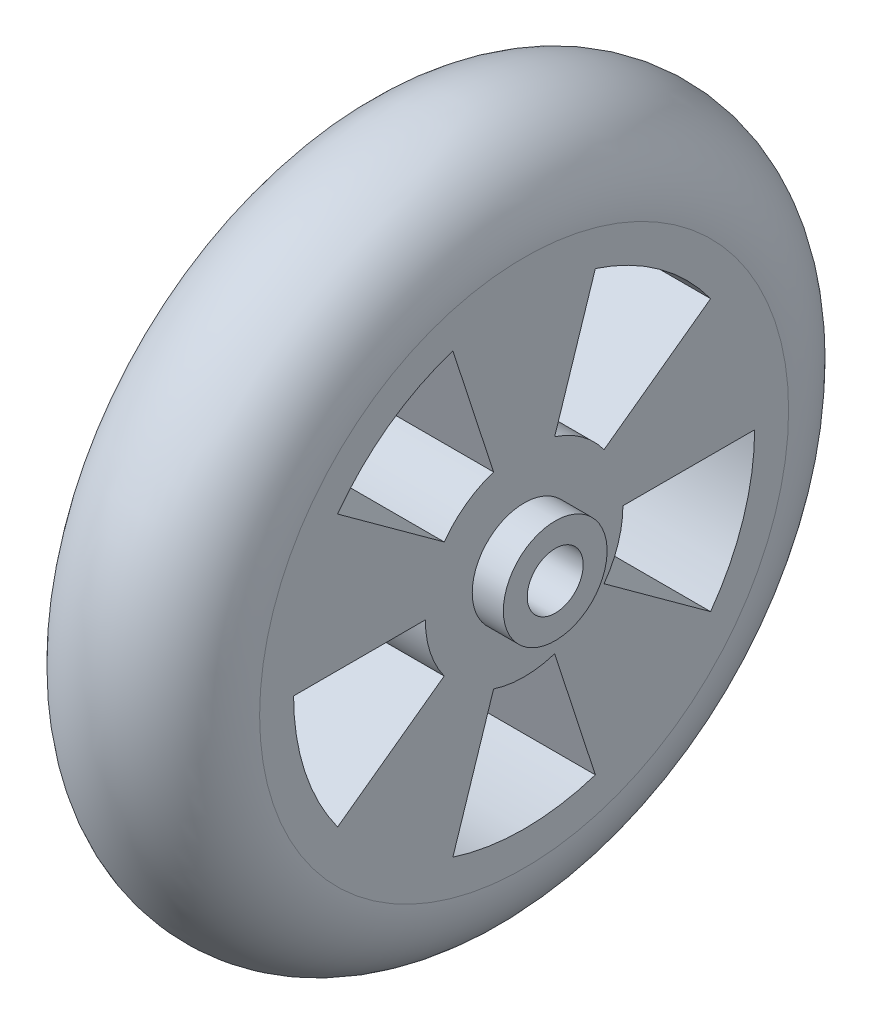
ISO-10303-21;
HEADER;
FILE_DESCRIPTION(('STEP AP214'),'2;1');
FILE_NAME('part.step','',(''),(''),'','','');
FILE_SCHEMA(('AUTOMOTIVE_DESIGN { 1 0 10303 214 1 1 1 1 }'));
ENDSEC;
DATA;
#1=APPLICATION_CONTEXT('core data for automotive mechanical design processes');
#2=APPLICATION_PROTOCOL_DEFINITION('international standard','automotive_design',2000,#1);
#3=PRODUCT_CONTEXT('',#1,'mechanical');
#4=PRODUCT('Part','Part','',(#3));
#5=PRODUCT_RELATED_PRODUCT_CATEGORY('part','',(#4));
#6=PRODUCT_DEFINITION_FORMATION('','',#4);
#7=PRODUCT_DEFINITION_CONTEXT('part definition',#1,'design');
#8=PRODUCT_DEFINITION('design','',#6,#7);
#9=PRODUCT_DEFINITION_SHAPE('','',#8);
#10=(LENGTH_UNIT() NAMED_UNIT(*) SI_UNIT(.MILLI.,.METRE.));
#11=(NAMED_UNIT(*) PLANE_ANGLE_UNIT() SI_UNIT($,.RADIAN.));
#12=(NAMED_UNIT(*) SI_UNIT($,.STERADIAN.) SOLID_ANGLE_UNIT());
#13=UNCERTAINTY_MEASURE_WITH_UNIT(LENGTH_MEASURE(1.E-05),#10,'distance_accuracy_value','');
#14=(GEOMETRIC_REPRESENTATION_CONTEXT(3) GLOBAL_UNCERTAINTY_ASSIGNED_CONTEXT((#13)) GLOBAL_UNIT_ASSIGNED_CONTEXT((#10,
#11,#12)) REPRESENTATION_CONTEXT('',''));
#15=CARTESIAN_POINT('',(0.,0.,0.));
#16=DIRECTION('',(0.,0.,1.));
#17=DIRECTION('',(1.,0.,0.));
#18=AXIS2_PLACEMENT_3D('',#15,#16,#17);
#19=CARTESIAN_POINT('',(8.49999999999999,0.,0.));
#20=DIRECTION('',(-1.,0.,0.));
#21=DIRECTION('',(0.,0.,1.));
#22=AXIS2_PLACEMENT_3D('',#19,#20,#21);
#23=TOROIDAL_SURFACE('',#22,25.5,8.5);
#24=CARTESIAN_POINT('',(0.,0.,0.));
#25=DIRECTION('',(-1.,0.,0.));
#26=DIRECTION('',(0.,0.,1.));
#27=AXIS2_PLACEMENT_3D('',#24,#25,#26);
#28=CIRCLE('',#27,25.5);
#29=CARTESIAN_POINT('',(0.,0.,25.5));
#30=VERTEX_POINT('',#29);
#31=EDGE_CURVE('E404',#30,#30,#28,.T.);
#32=ORIENTED_EDGE('',*,*,#31,.F.);
#33=EDGE_LOOP('',(#32));
#34=FACE_BOUND('',#33,.T.);
#35=CARTESIAN_POINT('',(17.,0.,0.));
#36=DIRECTION('',(-1.,0.,0.));
#37=DIRECTION('',(0.,0.,1.));
#38=AXIS2_PLACEMENT_3D('',#35,#36,#37);
#39=CIRCLE('',#38,25.5);
#40=CARTESIAN_POINT('',(17.,0.,25.5));
#41=VERTEX_POINT('',#40);
#42=EDGE_CURVE('E11',#41,#41,#39,.T.);
#43=ORIENTED_EDGE('',*,*,#42,.T.);
#44=EDGE_LOOP('',(#43));
#45=FACE_BOUND('',#44,.T.);
#46=ADVANCED_FACE('F39',(#34,#45),#23,.T.);
#47=CARTESIAN_POINT('',(17.,5.,0.));
#48=DIRECTION('',(-1.,0.,0.));
#49=DIRECTION('',(0.,0.,1.));
#50=AXIS2_PLACEMENT_3D('',#47,#48,#49);
#51=PLANE('',#50);
#52=DIRECTION('',(0.,0.951056516295154,-0.309016994374948));
#53=VECTOR('',#52,1.);
#54=CARTESIAN_POINT('',(17.,4.52254248593737,-1.46946313073119));
#55=LINE('',#54,#53);
#56=CARTESIAN_POINT('',(17.,9.05881331771134,-2.94338687142138));
#57=VERTEX_POINT('',#56);
#58=CARTESIAN_POINT('',(17.,21.1372310746598,-6.86790269998322));
#59=VERTEX_POINT('',#58);
#60=EDGE_CURVE('E391',#57,#59,#55,.T.);
#61=ORIENTED_EDGE('',*,*,#60,.T.);
#62=CARTESIAN_POINT('',(17.,0.,0.));
#63=DIRECTION('',(-1.,0.,0.));
#64=DIRECTION('',(0.,0.,1.));
#65=AXIS2_PLACEMENT_3D('',#62,#63,#64);
#66=CIRCLE('',#65,22.225);
#67=CARTESIAN_POINT('',(17.,13.0635272322002,-17.9804026999832));
#68=VERTEX_POINT('',#67);
#69=EDGE_CURVE('E395',#59,#68,#66,.T.);
#70=ORIENTED_EDGE('',*,*,#69,.T.);
#71=DIRECTION('',(0.,0.587785252292471,-0.809016994374949));
#72=VECTOR('',#71,1.);
#73=CARTESIAN_POINT('',(17.,1.72745751406262,-2.37764129073788));
#74=LINE('',#73,#72);
#75=CARTESIAN_POINT('',(17.,5.59865452808579,-7.70588687142139));
#76=VERTEX_POINT('',#75);
#77=EDGE_CURVE('E385',#76,#68,#74,.T.);
#78=ORIENTED_EDGE('',*,*,#77,.F.);
#79=CARTESIAN_POINT('',(17.,0.,0.));
#80=DIRECTION('',(-1.,0.,0.));
#81=DIRECTION('',(0.,0.,1.));
#82=AXIS2_PLACEMENT_3D('',#79,#80,#81);
#83=CIRCLE('',#82,9.525);
#84=EDGE_CURVE('E388',#57,#76,#83,.T.);
#85=ORIENTED_EDGE('',*,*,#84,.F.);
#86=EDGE_LOOP('',(#61,#70,#78,#85));
#87=FACE_BOUND('',#86,.T.);
#88=CARTESIAN_POINT('',(17.,0.,0.));
#89=DIRECTION('',(-1.,0.,0.));
#90=DIRECTION('',(0.,0.,1.));
#91=AXIS2_PLACEMENT_3D('',#88,#89,#90);
#92=CIRCLE('',#91,9.525);
#93=CARTESIAN_POINT('',(17.,0.,-9.525));
#94=VERTEX_POINT('',#93);
#95=CARTESIAN_POINT('',(17.,-5.59865452808582,-7.70588687142136));
#96=VERTEX_POINT('',#95);
#97=EDGE_CURVE('E378',#94,#96,#92,.T.);
#98=ORIENTED_EDGE('',*,*,#97,.F.);
#99=DIRECTION('',(0.,0.,-1.));
#100=VECTOR('',#99,1.);
#101=CARTESIAN_POINT('',(17.,0.,0.));
#102=LINE('',#101,#100);
#103=CARTESIAN_POINT('',(17.,0.,-22.225));
#104=VERTEX_POINT('',#103);
#105=EDGE_CURVE('E381',#94,#104,#102,.T.);
#106=ORIENTED_EDGE('',*,*,#105,.T.);
#107=CARTESIAN_POINT('',(17.,0.,0.));
#108=DIRECTION('',(-1.,0.,0.));
#109=DIRECTION('',(0.,0.,1.));
#110=AXIS2_PLACEMENT_3D('',#107,#108,#109);
#111=CIRCLE('',#110,22.225);
#112=CARTESIAN_POINT('',(17.,-13.0635272322003,-17.9804026999832));
#113=VERTEX_POINT('',#112);
#114=EDGE_CURVE('E371',#104,#113,#111,.T.);
#115=ORIENTED_EDGE('',*,*,#114,.T.);
#116=DIRECTION('',(0.,-0.587785252292475,-0.809016994374946));
#117=VECTOR('',#116,1.);
#118=CARTESIAN_POINT('',(17.,1.72745751406264,2.37764129073789));
#119=LINE('',#118,#117);
#120=EDGE_CURVE('E375',#96,#113,#119,.T.);
#121=ORIENTED_EDGE('',*,*,#120,.F.);
#122=EDGE_LOOP('',(#98,#106,#115,#121));
#123=FACE_BOUND('',#122,.T.);
#124=CARTESIAN_POINT('',(17.,0.,0.));
#125=DIRECTION('',(-1.,0.,0.));
#126=DIRECTION('',(0.,0.,1.));
#127=AXIS2_PLACEMENT_3D('',#124,#125,#126);
#128=CIRCLE('',#127,9.52500000000001);
#129=CARTESIAN_POINT('',(17.,-9.05881331771135,-2.94338687142137));
#130=VERTEX_POINT('',#129);
#131=CARTESIAN_POINT('',(17.,-9.05881331771134,2.94338687142139));
#132=VERTEX_POINT('',#131);
#133=EDGE_CURVE('E366',#130,#132,#128,.T.);
#134=ORIENTED_EDGE('',*,*,#133,.F.);
#135=DIRECTION('',(0.,-0.951056516295154,-0.309016994374947));
#136=VECTOR('',#135,1.);
#137=CARTESIAN_POINT('',(17.,4.52254248593737,1.46946313073118));
#138=LINE('',#137,#136);
#139=CARTESIAN_POINT('',(17.,-21.1372310746598,-6.86790269998319));
#140=VERTEX_POINT('',#139);
#141=EDGE_CURVE('E183',#130,#140,#138,.T.);
#142=ORIENTED_EDGE('',*,*,#141,.T.);
#143=CARTESIAN_POINT('',(17.,0.,0.));
#144=DIRECTION('',(-1.,0.,0.));
#145=DIRECTION('',(0.,0.,1.));
#146=AXIS2_PLACEMENT_3D('',#143,#144,#145);
#147=CIRCLE('',#146,22.225);
#148=CARTESIAN_POINT('',(17.,-21.1372310746598,6.86790269998325));
#149=VERTEX_POINT('',#148);
#150=EDGE_CURVE('E358',#140,#149,#147,.T.);
#151=ORIENTED_EDGE('',*,*,#150,.T.);
#152=DIRECTION('',(0.,-0.951056516295153,0.309016994374949));
#153=VECTOR('',#152,1.);
#154=CARTESIAN_POINT('',(17.,4.52254248593736,-1.46946313073119));
#155=LINE('',#154,#153);
#156=EDGE_CURVE('E362',#132,#149,#155,.T.);
#157=ORIENTED_EDGE('',*,*,#156,.F.);
#158=EDGE_LOOP('',(#134,#142,#151,#157));
#159=FACE_BOUND('',#158,.T.);
#160=CARTESIAN_POINT('',(17.,0.,0.));
#161=DIRECTION('',(-1.,0.,0.));
#162=DIRECTION('',(0.,0.,1.));
#163=AXIS2_PLACEMENT_3D('',#160,#161,#162);
#164=CIRCLE('',#163,9.525);
#165=CARTESIAN_POINT('',(17.,-5.5986545280858,7.70588687142138));
#166=VERTEX_POINT('',#165);
#167=CARTESIAN_POINT('',(17.,0.,9.525));
#168=VERTEX_POINT('',#167);
#169=EDGE_CURVE('E351',#166,#168,#164,.T.);
#170=ORIENTED_EDGE('',*,*,#169,.F.);
#171=DIRECTION('',(0.,-0.587785252292473,0.809016994374948));
#172=VECTOR('',#171,1.);
#173=CARTESIAN_POINT('',(17.,1.72745751406263,-2.37764129073788));
#174=LINE('',#173,#172);
#175=CARTESIAN_POINT('',(17.,-13.0635272322002,17.9804026999832));
#176=VERTEX_POINT('',#175);
#177=EDGE_CURVE('E354',#166,#176,#174,.T.);
#178=ORIENTED_EDGE('',*,*,#177,.T.);
#179=CARTESIAN_POINT('',(17.,0.,0.));
#180=DIRECTION('',(-1.,0.,0.));
#181=DIRECTION('',(0.,0.,1.));
#182=AXIS2_PLACEMENT_3D('',#179,#180,#181);
#183=CIRCLE('',#182,22.225);
#184=CARTESIAN_POINT('',(17.,0.,22.225));
#185=VERTEX_POINT('',#184);
#186=EDGE_CURVE('E343',#176,#185,#183,.T.);
#187=ORIENTED_EDGE('',*,*,#186,.T.);
#188=DIRECTION('',(0.,0.,1.));
#189=VECTOR('',#188,1.);
#190=CARTESIAN_POINT('',(17.,0.,0.));
#191=LINE('',#190,#189);
#192=EDGE_CURVE('E347',#168,#185,#191,.T.);
#193=ORIENTED_EDGE('',*,*,#192,.F.);
#194=EDGE_LOOP('',(#170,#178,#187,#193));
#195=FACE_BOUND('',#194,.T.);
#196=CARTESIAN_POINT('',(17.,0.,0.));
#197=DIRECTION('',(-1.,0.,0.));
#198=DIRECTION('',(0.,0.,1.));
#199=AXIS2_PLACEMENT_3D('',#196,#197,#198);
#200=CIRCLE('',#199,9.525);
#201=CARTESIAN_POINT('',(17.,5.59865452808581,7.70588687142137));
#202=VERTEX_POINT('',#201);
#203=CARTESIAN_POINT('',(17.,9.05881331771135,2.94338687142136));
#204=VERTEX_POINT('',#203);
#205=EDGE_CURVE('E336',#202,#204,#200,.T.);
#206=ORIENTED_EDGE('',*,*,#205,.F.);
#207=DIRECTION('',(0.,0.587785252292474,0.809016994374947));
#208=VECTOR('',#207,1.);
#209=CARTESIAN_POINT('',(17.,1.72745751406263,2.37764129073788));
#210=LINE('',#209,#208);
#211=CARTESIAN_POINT('',(17.,13.0635272322002,17.9804026999832));
#212=VERTEX_POINT('',#211);
#213=EDGE_CURVE('E339',#202,#212,#210,.T.);
#214=ORIENTED_EDGE('',*,*,#213,.T.);
#215=CARTESIAN_POINT('',(17.,0.,0.));
#216=DIRECTION('',(-1.,0.,0.));
#217=DIRECTION('',(0.,0.,1.));
#218=AXIS2_PLACEMENT_3D('',#215,#216,#217);
#219=CIRCLE('',#218,22.225);
#220=CARTESIAN_POINT('',(17.,21.1372310746598,6.86790269998316));
#221=VERTEX_POINT('',#220);
#222=EDGE_CURVE('E328',#212,#221,#219,.T.);
#223=ORIENTED_EDGE('',*,*,#222,.T.);
#224=DIRECTION('',(0.,0.951056516295154,0.309016994374946));
#225=VECTOR('',#224,1.);
#226=CARTESIAN_POINT('',(17.,4.52254248593737,1.46946313073117));
#227=LINE('',#226,#225);
#228=EDGE_CURVE('E332',#204,#221,#227,.T.);
#229=ORIENTED_EDGE('',*,*,#228,.F.);
#230=EDGE_LOOP('',(#206,#214,#223,#229));
#231=FACE_BOUND('',#230,.T.);
#232=ORIENTED_EDGE('',*,*,#42,.F.);
#233=EDGE_LOOP('',(#232));
#234=FACE_BOUND('',#233,.T.);
#235=CARTESIAN_POINT('',(17.,0.,0.));
#236=DIRECTION('',(-1.,0.,0.));
#237=DIRECTION('',(0.,0.,1.));
#238=AXIS2_PLACEMENT_3D('',#235,#236,#237);
#239=CIRCLE('',#238,5.);
#240=CARTESIAN_POINT('',(17.,0.,5.));
#241=VERTEX_POINT('',#240);
#242=EDGE_CURVE('E47',#241,#241,#239,.T.);
#243=ORIENTED_EDGE('',*,*,#242,.T.);
#244=EDGE_LOOP('',(#243));
#245=FACE_BOUND('',#244,.T.);
#246=ADVANCED_FACE('F418',(#87,#123,#159,#195,#231,#234,#245),#51,.F.);
#247=CARTESIAN_POINT('',(0.,0.,0.));
#248=DIRECTION('',(-1.,0.,0.));
#249=DIRECTION('',(0.,0.,1.));
#250=AXIS2_PLACEMENT_3D('',#247,#248,#249);
#251=CYLINDRICAL_SURFACE('',#250,5.);
#252=ORIENTED_EDGE('',*,*,#242,.F.);
#253=EDGE_LOOP('',(#252));
#254=FACE_BOUND('',#253,.T.);
#255=CARTESIAN_POINT('',(20.,0.,0.));
#256=DIRECTION('',(-1.,0.,0.));
#257=DIRECTION('',(0.,0.,1.));
#258=AXIS2_PLACEMENT_3D('',#255,#256,#257);
#259=CIRCLE('',#258,5.);
#260=CARTESIAN_POINT('',(20.,0.,5.));
#261=VERTEX_POINT('',#260);
#262=EDGE_CURVE('E411',#261,#261,#259,.T.);
#263=ORIENTED_EDGE('',*,*,#262,.T.);
#264=EDGE_LOOP('',(#263));
#265=FACE_BOUND('',#264,.T.);
#266=ADVANCED_FACE('F420',(#254,#265),#251,.T.);
#267=CARTESIAN_POINT('',(20.,0.,0.));
#268=DIRECTION('',(-1.,0.,0.));
#269=DIRECTION('',(0.,0.,1.));
#270=AXIS2_PLACEMENT_3D('',#267,#268,#269);
#271=PLANE('',#270);
#272=CARTESIAN_POINT('',(20.,0.,0.));
#273=DIRECTION('',(1.,0.,0.));
#274=DIRECTION('',(0.,0.,-1.));
#275=AXIS2_PLACEMENT_3D('',#272,#273,#274);
#276=CIRCLE('',#275,2.7);
#277=CARTESIAN_POINT('',(20.,0.,-2.7));
#278=VERTEX_POINT('',#277);
#279=EDGE_CURVE('E400',#278,#278,#276,.T.);
#280=ORIENTED_EDGE('',*,*,#279,.F.);
#281=EDGE_LOOP('',(#280));
#282=FACE_BOUND('',#281,.T.);
#283=ORIENTED_EDGE('',*,*,#262,.F.);
#284=EDGE_LOOP('',(#283));
#285=FACE_BOUND('',#284,.T.);
#286=ADVANCED_FACE('F423',(#282,#285),#271,.F.);
#287=CARTESIAN_POINT('',(0.,25.5,0.));
#288=DIRECTION('',(1.,0.,0.));
#289=DIRECTION('',(0.,0.,-1.));
#290=AXIS2_PLACEMENT_3D('',#287,#288,#289);
#291=PLANE('',#290);
#292=DIRECTION('',(0.,0.587785252292471,-0.809016994374949));
#293=VECTOR('',#292,1.);
#294=CARTESIAN_POINT('',(0.,0.,0.));
#295=LINE('',#294,#293);
#296=CARTESIAN_POINT('',(0.,5.59865452808579,-7.70588687142139));
#297=VERTEX_POINT('',#296);
#298=CARTESIAN_POINT('',(0.,13.0635272322002,-17.9804026999832));
#299=VERTEX_POINT('',#298);
#300=EDGE_CURVE('E260',#297,#299,#295,.T.);
#301=ORIENTED_EDGE('',*,*,#300,.T.);
#302=CARTESIAN_POINT('',(0.,0.,0.));
#303=DIRECTION('',(1.,0.,0.));
#304=DIRECTION('',(0.,0.,-1.));
#305=AXIS2_PLACEMENT_3D('',#302,#303,#304);
#306=CIRCLE('',#305,22.225);
#307=CARTESIAN_POINT('',(0.,21.1372310746598,-6.86790269998322));
#308=VERTEX_POINT('',#307);
#309=EDGE_CURVE('E248',#308,#299,#306,.F.);
#310=ORIENTED_EDGE('',*,*,#309,.F.);
#311=DIRECTION('',(0.,0.951056516295153,-0.309016994374948));
#312=VECTOR('',#311,1.);
#313=CARTESIAN_POINT('',(0.,0.,0.));
#314=LINE('',#313,#312);
#315=CARTESIAN_POINT('',(0.,9.05881331771134,-2.94338687142138));
#316=VERTEX_POINT('',#315);
#317=EDGE_CURVE('E251',#316,#308,#314,.T.);
#318=ORIENTED_EDGE('',*,*,#317,.F.);
#319=CARTESIAN_POINT('',(0.,0.,0.));
#320=DIRECTION('',(1.,0.,0.));
#321=DIRECTION('',(0.,0.,-1.));
#322=AXIS2_PLACEMENT_3D('',#319,#320,#321);
#323=CIRCLE('',#322,9.525);
#324=EDGE_CURVE('E256',#316,#297,#323,.F.);
#325=ORIENTED_EDGE('',*,*,#324,.T.);
#326=EDGE_LOOP('',(#301,#310,#318,#325));
#327=FACE_BOUND('',#326,.T.);
#328=CARTESIAN_POINT('',(0.,0.,0.));
#329=DIRECTION('',(1.,0.,0.));
#330=DIRECTION('',(0.,0.,-1.));
#331=AXIS2_PLACEMENT_3D('',#328,#329,#330);
#332=CIRCLE('',#331,22.225);
#333=CARTESIAN_POINT('',(0.,0.,-22.225));
#334=VERTEX_POINT('',#333);
#335=CARTESIAN_POINT('',(0.,-13.0635272322003,-17.9804026999832));
#336=VERTEX_POINT('',#335);
#337=EDGE_CURVE('E287',#334,#336,#332,.F.);
#338=ORIENTED_EDGE('',*,*,#337,.F.);
#339=DIRECTION('',(0.,0.,-1.));
#340=VECTOR('',#339,1.);
#341=CARTESIAN_POINT('',(0.,0.,0.));
#342=LINE('',#341,#340);
#343=CARTESIAN_POINT('',(0.,0.,-9.525));
#344=VERTEX_POINT('',#343);
#345=EDGE_CURVE('E187',#344,#334,#342,.T.);
#346=ORIENTED_EDGE('',*,*,#345,.F.);
#347=CARTESIAN_POINT('',(0.,0.,0.));
#348=DIRECTION('',(1.,0.,0.));
#349=DIRECTION('',(0.,0.,-1.));
#350=AXIS2_PLACEMENT_3D('',#347,#348,#349);
#351=CIRCLE('',#350,9.525);
#352=CARTESIAN_POINT('',(0.,-5.59865452808582,-7.70588687142136));
#353=VERTEX_POINT('',#352);
#354=EDGE_CURVE('E279',#344,#353,#351,.F.);
#355=ORIENTED_EDGE('',*,*,#354,.T.);
#356=DIRECTION('',(0.,-0.587785252292475,-0.809016994374946));
#357=VECTOR('',#356,1.);
#358=CARTESIAN_POINT('',(0.,0.,0.));
#359=LINE('',#358,#357);
#360=EDGE_CURVE('E283',#353,#336,#359,.T.);
#361=ORIENTED_EDGE('',*,*,#360,.T.);
#362=EDGE_LOOP('',(#338,#346,#355,#361));
#363=FACE_BOUND('',#362,.T.);
#364=CARTESIAN_POINT('',(0.,0.,0.));
#365=DIRECTION('',(1.,0.,0.));
#366=DIRECTION('',(0.,0.,-1.));
#367=AXIS2_PLACEMENT_3D('',#364,#365,#366);
#368=CIRCLE('',#367,22.225);
#369=CARTESIAN_POINT('',(0.,-21.1372310746598,-6.8679026999832));
#370=VERTEX_POINT('',#369);
#371=CARTESIAN_POINT('',(0.,-21.1372310746598,6.86790269998325));
#372=VERTEX_POINT('',#371);
#373=EDGE_CURVE('E204',#370,#372,#368,.F.);
#374=ORIENTED_EDGE('',*,*,#373,.F.);
#375=DIRECTION('',(0.,-0.951056516295154,-0.309016994374947));
#376=VECTOR('',#375,1.);
#377=CARTESIAN_POINT('',(0.,0.,0.));
#378=LINE('',#377,#376);
#379=CARTESIAN_POINT('',(0.,-9.05881331771135,-2.94338687142137));
#380=VERTEX_POINT('',#379);
#381=EDGE_CURVE('E180',#380,#370,#378,.T.);
#382=ORIENTED_EDGE('',*,*,#381,.F.);
#383=CARTESIAN_POINT('',(0.,0.,0.));
#384=DIRECTION('',(1.,0.,0.));
#385=DIRECTION('',(0.,0.,-1.));
#386=AXIS2_PLACEMENT_3D('',#383,#384,#385);
#387=CIRCLE('',#386,9.52500000000001);
#388=CARTESIAN_POINT('',(0.,-9.05881331771134,2.94338687142139));
#389=VERTEX_POINT('',#388);
#390=EDGE_CURVE('E191',#380,#389,#387,.F.);
#391=ORIENTED_EDGE('',*,*,#390,.T.);
#392=DIRECTION('',(0.,-0.951056516295153,0.309016994374949));
#393=VECTOR('',#392,1.);
#394=CARTESIAN_POINT('',(0.,0.,0.));
#395=LINE('',#394,#393);
#396=EDGE_CURVE('E198',#389,#372,#395,.T.);
#397=ORIENTED_EDGE('',*,*,#396,.T.);
#398=EDGE_LOOP('',(#374,#382,#391,#397));
#399=FACE_BOUND('',#398,.T.);
#400=CARTESIAN_POINT('',(0.,0.,0.));
#401=DIRECTION('',(1.,0.,0.));
#402=DIRECTION('',(0.,0.,-1.));
#403=AXIS2_PLACEMENT_3D('',#400,#401,#402);
#404=CIRCLE('',#403,22.225);
#405=CARTESIAN_POINT('',(0.,-13.0635272322002,17.9804026999832));
#406=VERTEX_POINT('',#405);
#407=CARTESIAN_POINT('',(0.,0.,22.225));
#408=VERTEX_POINT('',#407);
#409=EDGE_CURVE('E235',#406,#408,#404,.F.);
#410=ORIENTED_EDGE('',*,*,#409,.F.);
#411=DIRECTION('',(0.,-0.587785252292473,0.809016994374948));
#412=VECTOR('',#411,1.);
#413=CARTESIAN_POINT('',(0.,0.,0.));
#414=LINE('',#413,#412);
#415=CARTESIAN_POINT('',(0.,-5.5986545280858,7.70588687142138));
#416=VERTEX_POINT('',#415);
#417=EDGE_CURVE('E224',#416,#406,#414,.T.);
#418=ORIENTED_EDGE('',*,*,#417,.F.);
#419=CARTESIAN_POINT('',(0.,0.,0.));
#420=DIRECTION('',(1.,0.,0.));
#421=DIRECTION('',(0.,0.,-1.));
#422=AXIS2_PLACEMENT_3D('',#419,#420,#421);
#423=CIRCLE('',#422,9.525);
#424=CARTESIAN_POINT('',(0.,0.,9.525));
#425=VERTEX_POINT('',#424);
#426=EDGE_CURVE('E227',#416,#425,#423,.F.);
#427=ORIENTED_EDGE('',*,*,#426,.T.);
#428=DIRECTION('',(0.,0.,1.));
#429=VECTOR('',#428,1.);
#430=CARTESIAN_POINT('',(0.,0.,0.));
#431=LINE('',#430,#429);
#432=EDGE_CURVE('E231',#425,#408,#431,.T.);
#433=ORIENTED_EDGE('',*,*,#432,.T.);
#434=EDGE_LOOP('',(#410,#418,#427,#433));
#435=FACE_BOUND('',#434,.T.);
#436=CARTESIAN_POINT('',(0.,0.,0.));
#437=DIRECTION('',(1.,0.,0.));
#438=DIRECTION('',(0.,0.,-1.));
#439=AXIS2_PLACEMENT_3D('',#436,#437,#438);
#440=CIRCLE('',#439,22.225);
#441=CARTESIAN_POINT('',(0.,13.0635272322002,17.9804026999832));
#442=VERTEX_POINT('',#441);
#443=CARTESIAN_POINT('',(0.,21.1372310746598,6.86790269998316));
#444=VERTEX_POINT('',#443);
#445=EDGE_CURVE('E311',#442,#444,#440,.F.);
#446=ORIENTED_EDGE('',*,*,#445,.F.);
#447=DIRECTION('',(0.,0.587785252292474,0.809016994374947));
#448=VECTOR('',#447,1.);
#449=CARTESIAN_POINT('',(0.,0.,0.));
#450=LINE('',#449,#448);
#451=CARTESIAN_POINT('',(0.,5.59865452808581,7.70588687142137));
#452=VERTEX_POINT('',#451);
#453=EDGE_CURVE('E276',#452,#442,#450,.T.);
#454=ORIENTED_EDGE('',*,*,#453,.F.);
#455=CARTESIAN_POINT('',(0.,0.,0.));
#456=DIRECTION('',(1.,0.,0.));
#457=DIRECTION('',(0.,0.,-1.));
#458=AXIS2_PLACEMENT_3D('',#455,#456,#457);
#459=CIRCLE('',#458,9.525);
#460=CARTESIAN_POINT('',(0.,9.05881331771135,2.94338687142136));
#461=VERTEX_POINT('',#460);
#462=EDGE_CURVE('E303',#452,#461,#459,.F.);
#463=ORIENTED_EDGE('',*,*,#462,.T.);
#464=DIRECTION('',(0.,0.951056516295154,0.309016994374946));
#465=VECTOR('',#464,1.);
#466=CARTESIAN_POINT('',(0.,0.,0.));
#467=LINE('',#466,#465);
#468=EDGE_CURVE('E307',#461,#444,#467,.T.);
#469=ORIENTED_EDGE('',*,*,#468,.T.);
#470=EDGE_LOOP('',(#446,#454,#463,#469));
#471=FACE_BOUND('',#470,.T.);
#472=CARTESIAN_POINT('',(0.,0.,0.));
#473=DIRECTION('',(1.,0.,0.));
#474=DIRECTION('',(0.,0.,-1.));
#475=AXIS2_PLACEMENT_3D('',#472,#473,#474);
#476=CIRCLE('',#475,2.7);
#477=CARTESIAN_POINT('',(0.,0.,-2.7));
#478=VERTEX_POINT('',#477);
#479=EDGE_CURVE('E399',#478,#478,#476,.T.);
#480=ORIENTED_EDGE('',*,*,#479,.T.);
#481=EDGE_LOOP('',(#480));
#482=FACE_BOUND('',#481,.T.);
#483=ORIENTED_EDGE('',*,*,#31,.T.);
#484=EDGE_LOOP('',(#483));
#485=FACE_BOUND('',#484,.T.);
#486=ADVANCED_FACE('F201',(#327,#363,#399,#435,#471,#482,#485),#291,.F.);
#487=CARTESIAN_POINT('',(20.,0.,0.));
#488=DIRECTION('',(-1.,0.,0.));
#489=DIRECTION('',(0.,0.,1.));
#490=AXIS2_PLACEMENT_3D('',#487,#488,#489);
#491=CYLINDRICAL_SURFACE('',#490,2.7);
#492=ORIENTED_EDGE('',*,*,#279,.T.);
#493=EDGE_LOOP('',(#492));
#494=FACE_BOUND('',#493,.T.);
#495=ORIENTED_EDGE('',*,*,#479,.F.);
#496=EDGE_LOOP('',(#495));
#497=FACE_BOUND('',#496,.T.);
#498=ADVANCED_FACE('F433',(#494,#497),#491,.F.);
#499=CARTESIAN_POINT('',(20.,0.,0.));
#500=DIRECTION('',(0.,-0.809016994374947,0.587785252292474));
#501=DIRECTION('',(0.,-0.587785252292474,-0.809016994374947));
#502=AXIS2_PLACEMENT_3D('',#499,#500,#501);
#503=PLANE('',#502);
#504=DIRECTION('',(-1.,0.,0.));
#505=VECTOR('',#504,1.);
#506=CARTESIAN_POINT('',(20.,5.59865452808581,7.70588687142137));
#507=LINE('',#506,#505);
#508=EDGE_CURVE('E325',#202,#452,#507,.T.);
#509=ORIENTED_EDGE('',*,*,#508,.T.);
#510=ORIENTED_EDGE('',*,*,#453,.T.);
#511=DIRECTION('',(-1.,0.,0.));
#512=VECTOR('',#511,1.);
#513=CARTESIAN_POINT('',(20.,13.0635272322002,17.9804026999832));
#514=LINE('',#513,#512);
#515=EDGE_CURVE('E315',#212,#442,#514,.T.);
#516=ORIENTED_EDGE('',*,*,#515,.F.);
#517=ORIENTED_EDGE('',*,*,#213,.F.);
#518=EDGE_LOOP('',(#509,#510,#516,#517));
#519=FACE_BOUND('',#518,.T.);
#520=ADVANCED_FACE('F476',(#519),#503,.F.);
#521=CARTESIAN_POINT('',(20.,0.,0.));
#522=DIRECTION('',(-1.,0.,0.));
#523=DIRECTION('',(0.,0.,1.));
#524=AXIS2_PLACEMENT_3D('',#521,#522,#523);
#525=CYLINDRICAL_SURFACE('',#524,9.525);
#526=ORIENTED_EDGE('',*,*,#205,.T.);
#527=DIRECTION('',(-1.,0.,0.));
#528=VECTOR('',#527,1.);
#529=CARTESIAN_POINT('',(20.,9.05881331771135,2.94338687142136));
#530=LINE('',#529,#528);
#531=EDGE_CURVE('E322',#204,#461,#530,.T.);
#532=ORIENTED_EDGE('',*,*,#531,.T.);
#533=ORIENTED_EDGE('',*,*,#462,.F.);
#534=ORIENTED_EDGE('',*,*,#508,.F.);
#535=EDGE_LOOP('',(#526,#532,#533,#534));
#536=FACE_BOUND('',#535,.T.);
#537=ADVANCED_FACE('F465',(#536),#525,.T.);
#538=CARTESIAN_POINT('',(20.,0.,0.));
#539=DIRECTION('',(0.,-0.309016994374946,0.951056516295154));
#540=DIRECTION('',(0.,-0.951056516295154,-0.309016994374946));
#541=AXIS2_PLACEMENT_3D('',#538,#539,#540);
#542=PLANE('',#541);
#543=ORIENTED_EDGE('',*,*,#228,.T.);
#544=DIRECTION('',(-1.,0.,0.));
#545=VECTOR('',#544,1.);
#546=CARTESIAN_POINT('',(20.,21.1372310746598,6.86790269998316));
#547=LINE('',#546,#545);
#548=EDGE_CURVE('E319',#221,#444,#547,.T.);
#549=ORIENTED_EDGE('',*,*,#548,.T.);
#550=ORIENTED_EDGE('',*,*,#468,.F.);
#551=ORIENTED_EDGE('',*,*,#531,.F.);
#552=EDGE_LOOP('',(#543,#549,#550,#551));
#553=FACE_BOUND('',#552,.T.);
#554=ADVANCED_FACE('F469',(#553),#542,.T.);
#555=CARTESIAN_POINT('',(20.,0.,0.));
#556=DIRECTION('',(-1.,0.,0.));
#557=DIRECTION('',(0.,0.,1.));
#558=AXIS2_PLACEMENT_3D('',#555,#556,#557);
#559=CYLINDRICAL_SURFACE('',#558,22.225);
#560=ORIENTED_EDGE('',*,*,#515,.T.);
#561=ORIENTED_EDGE('',*,*,#445,.T.);
#562=ORIENTED_EDGE('',*,*,#548,.F.);
#563=ORIENTED_EDGE('',*,*,#222,.F.);
#564=EDGE_LOOP('',(#560,#561,#562,#563));
#565=FACE_BOUND('',#564,.T.);
#566=ADVANCED_FACE('F478',(#565),#559,.F.);
#567=CARTESIAN_POINT('',(20.,0.,0.));
#568=DIRECTION('',(0.,-0.809016994374948,-0.587785252292473));
#569=DIRECTION('',(0.,0.587785252292473,-0.809016994374948));
#570=AXIS2_PLACEMENT_3D('',#567,#568,#569);
#571=PLANE('',#570);
#572=DIRECTION('',(-1.,0.,0.));
#573=VECTOR('',#572,1.);
#574=CARTESIAN_POINT('',(20.,-5.5986545280858,7.70588687142138));
#575=LINE('',#574,#573);
#576=EDGE_CURVE('E206',#166,#416,#575,.T.);
#577=ORIENTED_EDGE('',*,*,#576,.T.);
#578=ORIENTED_EDGE('',*,*,#417,.T.);
#579=DIRECTION('',(-1.,0.,0.));
#580=VECTOR('',#579,1.);
#581=CARTESIAN_POINT('',(20.,-13.0635272322002,17.9804026999832));
#582=LINE('',#581,#580);
#583=EDGE_CURVE('E239',#176,#406,#582,.T.);
#584=ORIENTED_EDGE('',*,*,#583,.F.);
#585=ORIENTED_EDGE('',*,*,#177,.F.);
#586=EDGE_LOOP('',(#577,#578,#584,#585));
#587=FACE_BOUND('',#586,.T.);
#588=ADVANCED_FACE('F480',(#587),#571,.F.);
#589=CARTESIAN_POINT('',(20.,0.,0.));
#590=DIRECTION('',(-1.,0.,0.));
#591=DIRECTION('',(0.,0.,1.));
#592=AXIS2_PLACEMENT_3D('',#589,#590,#591);
#593=CYLINDRICAL_SURFACE('',#592,9.525);
#594=ORIENTED_EDGE('',*,*,#169,.T.);
#595=DIRECTION('',(-1.,0.,0.));
#596=VECTOR('',#595,1.);
#597=CARTESIAN_POINT('',(20.,0.,9.525));
#598=LINE('',#597,#596);
#599=EDGE_CURVE('E209',#168,#425,#598,.T.);
#600=ORIENTED_EDGE('',*,*,#599,.T.);
#601=ORIENTED_EDGE('',*,*,#426,.F.);
#602=ORIENTED_EDGE('',*,*,#576,.F.);
#603=EDGE_LOOP('',(#594,#600,#601,#602));
#604=FACE_BOUND('',#603,.T.);
#605=ADVANCED_FACE('F486',(#604),#593,.T.);
#606=CARTESIAN_POINT('',(20.,0.,0.));
#607=DIRECTION('',(0.,-1.,0.));
#608=DIRECTION('',(0.,0.,-1.));
#609=AXIS2_PLACEMENT_3D('',#606,#607,#608);
#610=PLANE('',#609);
#611=ORIENTED_EDGE('',*,*,#192,.T.);
#612=DIRECTION('',(-1.,0.,0.));
#613=VECTOR('',#612,1.);
#614=CARTESIAN_POINT('',(20.,0.,22.225));
#615=LINE('',#614,#613);
#616=EDGE_CURVE('E243',#185,#408,#615,.T.);
#617=ORIENTED_EDGE('',*,*,#616,.T.);
#618=ORIENTED_EDGE('',*,*,#432,.F.);
#619=ORIENTED_EDGE('',*,*,#599,.F.);
#620=EDGE_LOOP('',(#611,#617,#618,#619));
#621=FACE_BOUND('',#620,.T.);
#622=ADVANCED_FACE('F537',(#621),#610,.T.);
#623=CARTESIAN_POINT('',(20.,0.,0.));
#624=DIRECTION('',(-1.,0.,0.));
#625=DIRECTION('',(0.,0.,1.));
#626=AXIS2_PLACEMENT_3D('',#623,#624,#625);
#627=CYLINDRICAL_SURFACE('',#626,22.225);
#628=ORIENTED_EDGE('',*,*,#583,.T.);
#629=ORIENTED_EDGE('',*,*,#409,.T.);
#630=ORIENTED_EDGE('',*,*,#616,.F.);
#631=ORIENTED_EDGE('',*,*,#186,.F.);
#632=EDGE_LOOP('',(#628,#629,#630,#631));
#633=FACE_BOUND('',#632,.T.);
#634=ADVANCED_FACE('F547',(#633),#627,.F.);
#635=CARTESIAN_POINT('',(20.,0.,0.));
#636=DIRECTION('',(0.,0.309016994374947,-0.951056516295154));
#637=DIRECTION('',(0.,0.951056516295154,0.309016994374947));
#638=AXIS2_PLACEMENT_3D('',#635,#636,#637);
#639=PLANE('',#638);
#640=DIRECTION('',(-1.,0.,0.));
#641=VECTOR('',#640,1.);
#642=CARTESIAN_POINT('',(20.,-9.05881331771135,-2.94338687142137));
#643=LINE('',#642,#641);
#644=EDGE_CURVE('E175',#130,#380,#643,.T.);
#645=ORIENTED_EDGE('',*,*,#644,.T.);
#646=ORIENTED_EDGE('',*,*,#381,.T.);
#647=DIRECTION('',(-1.,0.,0.));
#648=VECTOR('',#647,1.);
#649=CARTESIAN_POINT('',(20.,-21.1372310746598,-6.86790269998319));
#650=LINE('',#649,#648);
#651=EDGE_CURVE('E216',#140,#370,#650,.T.);
#652=ORIENTED_EDGE('',*,*,#651,.F.);
#653=ORIENTED_EDGE('',*,*,#141,.F.);
#654=EDGE_LOOP('',(#645,#646,#652,#653));
#655=FACE_BOUND('',#654,.T.);
#656=ADVANCED_FACE('F177',(#655),#639,.F.);
#657=CARTESIAN_POINT('',(20.,0.,0.));
#658=DIRECTION('',(-1.,0.,0.));
#659=DIRECTION('',(0.,0.,1.));
#660=AXIS2_PLACEMENT_3D('',#657,#658,#659);
#661=CYLINDRICAL_SURFACE('',#660,9.52500000000001);
#662=ORIENTED_EDGE('',*,*,#133,.T.);
#663=DIRECTION('',(-1.,0.,0.));
#664=VECTOR('',#663,1.);
#665=CARTESIAN_POINT('',(20.,-9.05881331771134,2.94338687142139));
#666=LINE('',#665,#664);
#667=EDGE_CURVE('E188',#132,#389,#666,.T.);
#668=ORIENTED_EDGE('',*,*,#667,.T.);
#669=ORIENTED_EDGE('',*,*,#390,.F.);
#670=ORIENTED_EDGE('',*,*,#644,.F.);
#671=EDGE_LOOP('',(#662,#668,#669,#670));
#672=FACE_BOUND('',#671,.T.);
#673=ADVANCED_FACE('F192',(#672),#661,.T.);
#674=CARTESIAN_POINT('',(20.,0.,0.));
#675=DIRECTION('',(0.,-0.309016994374949,-0.951056516295153));
#676=DIRECTION('',(0.,0.951056516295153,-0.309016994374949));
#677=AXIS2_PLACEMENT_3D('',#674,#675,#676);
#678=PLANE('',#677);
#679=ORIENTED_EDGE('',*,*,#156,.T.);
#680=DIRECTION('',(-1.,0.,0.));
#681=VECTOR('',#680,1.);
#682=CARTESIAN_POINT('',(20.,-21.1372310746598,6.86790269998325));
#683=LINE('',#682,#681);
#684=EDGE_CURVE('E219',#149,#372,#683,.T.);
#685=ORIENTED_EDGE('',*,*,#684,.T.);
#686=ORIENTED_EDGE('',*,*,#396,.F.);
#687=ORIENTED_EDGE('',*,*,#667,.F.);
#688=EDGE_LOOP('',(#679,#685,#686,#687));
#689=FACE_BOUND('',#688,.T.);
#690=ADVANCED_FACE('F574',(#689),#678,.T.);
#691=CARTESIAN_POINT('',(20.,0.,0.));
#692=DIRECTION('',(-1.,0.,0.));
#693=DIRECTION('',(0.,0.,1.));
#694=AXIS2_PLACEMENT_3D('',#691,#692,#693);
#695=CYLINDRICAL_SURFACE('',#694,22.225);
#696=ORIENTED_EDGE('',*,*,#651,.T.);
#697=ORIENTED_EDGE('',*,*,#373,.T.);
#698=ORIENTED_EDGE('',*,*,#684,.F.);
#699=ORIENTED_EDGE('',*,*,#150,.F.);
#700=EDGE_LOOP('',(#696,#697,#698,#699));
#701=FACE_BOUND('',#700,.T.);
#702=ADVANCED_FACE('F583',(#701),#695,.F.);
#703=CARTESIAN_POINT('',(20.,0.,0.));
#704=DIRECTION('',(0.,1.,0.));
#705=DIRECTION('',(0.,0.,1.));
#706=AXIS2_PLACEMENT_3D('',#703,#704,#705);
#707=PLANE('',#706);
#708=DIRECTION('',(-1.,0.,0.));
#709=VECTOR('',#708,1.);
#710=CARTESIAN_POINT('',(20.,0.,-9.525));
#711=LINE('',#710,#709);
#712=EDGE_CURVE('E252',#94,#344,#711,.T.);
#713=ORIENTED_EDGE('',*,*,#712,.T.);
#714=ORIENTED_EDGE('',*,*,#345,.T.);
#715=DIRECTION('',(-1.,0.,0.));
#716=VECTOR('',#715,1.);
#717=CARTESIAN_POINT('',(20.,0.,-22.225));
#718=LINE('',#717,#716);
#719=EDGE_CURVE('E290',#104,#334,#718,.T.);
#720=ORIENTED_EDGE('',*,*,#719,.F.);
#721=ORIENTED_EDGE('',*,*,#105,.F.);
#722=EDGE_LOOP('',(#713,#714,#720,#721));
#723=FACE_BOUND('',#722,.T.);
#724=ADVANCED_FACE('F491',(#723),#707,.F.);
#725=CARTESIAN_POINT('',(20.,0.,0.));
#726=DIRECTION('',(-1.,0.,0.));
#727=DIRECTION('',(0.,0.,1.));
#728=AXIS2_PLACEMENT_3D('',#725,#726,#727);
#729=CYLINDRICAL_SURFACE('',#728,9.525);
#730=ORIENTED_EDGE('',*,*,#97,.T.);
#731=DIRECTION('',(-1.,0.,0.));
#732=VECTOR('',#731,1.);
#733=CARTESIAN_POINT('',(20.,-5.59865452808582,-7.70588687142136));
#734=LINE('',#733,#732);
#735=EDGE_CURVE('E296',#96,#353,#734,.T.);
#736=ORIENTED_EDGE('',*,*,#735,.T.);
#737=ORIENTED_EDGE('',*,*,#354,.F.);
#738=ORIENTED_EDGE('',*,*,#712,.F.);
#739=EDGE_LOOP('',(#730,#736,#737,#738));
#740=FACE_BOUND('',#739,.T.);
#741=ADVANCED_FACE('F602',(#740),#729,.T.);
#742=CARTESIAN_POINT('',(20.,0.,0.));
#743=DIRECTION('',(0.,0.809016994374946,-0.587785252292475));
#744=DIRECTION('',(0.,0.587785252292475,0.809016994374946));
#745=AXIS2_PLACEMENT_3D('',#742,#743,#744);
#746=PLANE('',#745);
#747=ORIENTED_EDGE('',*,*,#120,.T.);
#748=DIRECTION('',(-1.,0.,0.));
#749=VECTOR('',#748,1.);
#750=CARTESIAN_POINT('',(20.,-13.0635272322003,-17.9804026999832));
#751=LINE('',#750,#749);
#752=EDGE_CURVE('E62',#113,#336,#751,.T.);
#753=ORIENTED_EDGE('',*,*,#752,.T.);
#754=ORIENTED_EDGE('',*,*,#360,.F.);
#755=ORIENTED_EDGE('',*,*,#735,.F.);
#756=EDGE_LOOP('',(#747,#753,#754,#755));
#757=FACE_BOUND('',#756,.T.);
#758=ADVANCED_FACE('F611',(#757),#746,.T.);
#759=CARTESIAN_POINT('',(20.,0.,0.));
#760=DIRECTION('',(-1.,0.,0.));
#761=DIRECTION('',(0.,0.,1.));
#762=AXIS2_PLACEMENT_3D('',#759,#760,#761);
#763=CYLINDRICAL_SURFACE('',#762,22.225);
#764=ORIENTED_EDGE('',*,*,#719,.T.);
#765=ORIENTED_EDGE('',*,*,#337,.T.);
#766=ORIENTED_EDGE('',*,*,#752,.F.);
#767=ORIENTED_EDGE('',*,*,#114,.F.);
#768=EDGE_LOOP('',(#764,#765,#766,#767));
#769=FACE_BOUND('',#768,.T.);
#770=ADVANCED_FACE('F620',(#769),#763,.F.);
#771=CARTESIAN_POINT('',(20.,0.,0.));
#772=DIRECTION('',(-1.,0.,0.));
#773=DIRECTION('',(0.,0.,1.));
#774=AXIS2_PLACEMENT_3D('',#771,#772,#773);
#775=CYLINDRICAL_SURFACE('',#774,22.225);
#776=DIRECTION('',(-1.,0.,0.));
#777=VECTOR('',#776,1.);
#778=CARTESIAN_POINT('',(20.,21.1372310746598,-6.86790269998322));
#779=LINE('',#778,#777);
#780=EDGE_CURVE('E273',#59,#308,#779,.T.);
#781=ORIENTED_EDGE('',*,*,#780,.T.);
#782=ORIENTED_EDGE('',*,*,#309,.T.);
#783=DIRECTION('',(-1.,0.,0.));
#784=VECTOR('',#783,1.);
#785=CARTESIAN_POINT('',(20.,13.0635272322002,-17.9804026999832));
#786=LINE('',#785,#784);
#787=EDGE_CURVE('E264',#68,#299,#786,.T.);
#788=ORIENTED_EDGE('',*,*,#787,.F.);
#789=ORIENTED_EDGE('',*,*,#69,.F.);
#790=EDGE_LOOP('',(#781,#782,#788,#789));
#791=FACE_BOUND('',#790,.T.);
#792=ADVANCED_FACE('F630',(#791),#775,.F.);
#793=CARTESIAN_POINT('',(20.,0.,0.));
#794=DIRECTION('',(0.,0.309016994374948,0.951056516295153));
#795=DIRECTION('',(0.,-0.951056516295154,0.309016994374948));
#796=AXIS2_PLACEMENT_3D('',#793,#794,#795);
#797=PLANE('',#796);
#798=DIRECTION('',(-1.,0.,0.));
#799=VECTOR('',#798,1.);
#800=CARTESIAN_POINT('',(20.,9.05881331771134,-2.94338687142138));
#801=LINE('',#800,#799);
#802=EDGE_CURVE('E270',#57,#316,#801,.T.);
#803=ORIENTED_EDGE('',*,*,#802,.T.);
#804=ORIENTED_EDGE('',*,*,#317,.T.);
#805=ORIENTED_EDGE('',*,*,#780,.F.);
#806=ORIENTED_EDGE('',*,*,#60,.F.);
#807=EDGE_LOOP('',(#803,#804,#805,#806));
#808=FACE_BOUND('',#807,.T.);
#809=ADVANCED_FACE('F639',(#808),#797,.F.);
#810=CARTESIAN_POINT('',(20.,0.,0.));
#811=DIRECTION('',(-1.,0.,0.));
#812=DIRECTION('',(0.,0.,1.));
#813=AXIS2_PLACEMENT_3D('',#810,#811,#812);
#814=CYLINDRICAL_SURFACE('',#813,9.525);
#815=ORIENTED_EDGE('',*,*,#84,.T.);
#816=DIRECTION('',(-1.,0.,0.));
#817=VECTOR('',#816,1.);
#818=CARTESIAN_POINT('',(20.,5.59865452808579,-7.70588687142139));
#819=LINE('',#818,#817);
#820=EDGE_CURVE('E54',#76,#297,#819,.T.);
#821=ORIENTED_EDGE('',*,*,#820,.T.);
#822=ORIENTED_EDGE('',*,*,#324,.F.);
#823=ORIENTED_EDGE('',*,*,#802,.F.);
#824=EDGE_LOOP('',(#815,#821,#822,#823));
#825=FACE_BOUND('',#824,.T.);
#826=ADVANCED_FACE('F649',(#825),#814,.T.);
#827=CARTESIAN_POINT('',(20.,0.,0.));
#828=DIRECTION('',(0.,0.809016994374949,0.587785252292471));
#829=DIRECTION('',(0.,-0.587785252292471,0.809016994374949));
#830=AXIS2_PLACEMENT_3D('',#827,#828,#829);
#831=PLANE('',#830);
#832=ORIENTED_EDGE('',*,*,#77,.T.);
#833=ORIENTED_EDGE('',*,*,#787,.T.);
#834=ORIENTED_EDGE('',*,*,#300,.F.);
#835=ORIENTED_EDGE('',*,*,#820,.F.);
#836=EDGE_LOOP('',(#832,#833,#834,#835));
#837=FACE_BOUND('',#836,.T.);
#838=ADVANCED_FACE('F659',(#837),#831,.T.);
#839=CLOSED_SHELL('',(#46,#246,#266,#286,#486,#498,#520,#537,#554,#566,#588,#605,#622,#634,#656,
#673,#690,#702,#724,#741,#758,#770,#792,#809,#826,#838));
#840=MANIFOLD_SOLID_BREP('B2',#839);
#841=ADVANCED_BREP_SHAPE_REPRESENTATION('',(#18,#840),#14);
#842=SHAPE_DEFINITION_REPRESENTATION(#9,#841);
ENDSEC;
END-ISO-10303-21;
